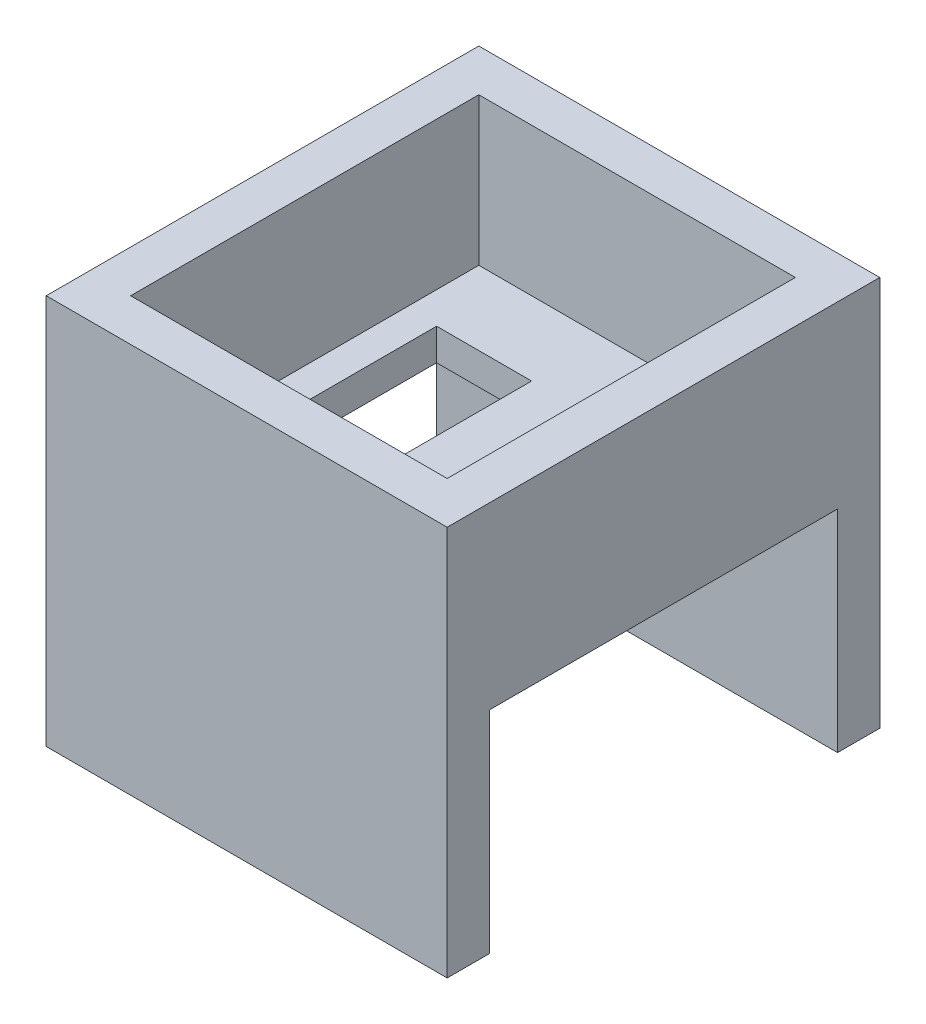
ISO-10303-21;
HEADER;
FILE_DESCRIPTION(('STEP AP214'),'2;1');
FILE_NAME('part.step','',(''),(''),'','','');
FILE_SCHEMA(('AUTOMOTIVE_DESIGN { 1 0 10303 214 1 1 1 1 }'));
ENDSEC;
DATA;
#1=APPLICATION_CONTEXT('core data for automotive mechanical design processes');
#2=APPLICATION_PROTOCOL_DEFINITION('international standard','automotive_design',2000,#1);
#3=PRODUCT_CONTEXT('',#1,'mechanical');
#4=PRODUCT('Part','Part','',(#3));
#5=PRODUCT_RELATED_PRODUCT_CATEGORY('part','',(#4));
#6=PRODUCT_DEFINITION_FORMATION('','',#4);
#7=PRODUCT_DEFINITION_CONTEXT('part definition',#1,'design');
#8=PRODUCT_DEFINITION('design','',#6,#7);
#9=PRODUCT_DEFINITION_SHAPE('','',#8);
#10=(LENGTH_UNIT() NAMED_UNIT(*) SI_UNIT(.MILLI.,.METRE.));
#11=(NAMED_UNIT(*) PLANE_ANGLE_UNIT() SI_UNIT($,.RADIAN.));
#12=(NAMED_UNIT(*) SI_UNIT($,.STERADIAN.) SOLID_ANGLE_UNIT());
#13=UNCERTAINTY_MEASURE_WITH_UNIT(LENGTH_MEASURE(1.E-05),#10,'distance_accuracy_value','');
#14=(GEOMETRIC_REPRESENTATION_CONTEXT(3) GLOBAL_UNCERTAINTY_ASSIGNED_CONTEXT((#13)) GLOBAL_UNIT_ASSIGNED_CONTEXT((#10,
#11,#12)) REPRESENTATION_CONTEXT('',''));
#15=CARTESIAN_POINT('',(0.,0.,0.));
#16=DIRECTION('',(0.,0.,1.));
#17=DIRECTION('',(1.,0.,0.));
#18=AXIS2_PLACEMENT_3D('',#15,#16,#17);
#19=CARTESIAN_POINT('',(0.,0.,0.));
#20=DIRECTION('',(0.,1.,0.));
#21=DIRECTION('',(0.,0.,1.));
#22=AXIS2_PLACEMENT_3D('',#19,#20,#21);
#23=PLANE('',#22);
#24=DIRECTION('',(0.,0.,1.));
#25=VECTOR('',#24,1.);
#26=CARTESIAN_POINT('',(-19.,0.,-20.5));
#27=LINE('',#26,#25);
#28=CARTESIAN_POINT('',(-19.,0.,16.5));
#29=VERTEX_POINT('',#28);
#30=CARTESIAN_POINT('',(-19.,0.,20.5));
#31=VERTEX_POINT('',#30);
#32=EDGE_CURVE('E251',#29,#31,#27,.T.);
#33=ORIENTED_EDGE('',*,*,#32,.F.);
#34=DIRECTION('',(-1.,0.,0.));
#35=VECTOR('',#34,1.);
#36=CARTESIAN_POINT('',(19.,0.,16.5));
#37=LINE('',#36,#35);
#38=CARTESIAN_POINT('',(19.,0.,16.5));
#39=VERTEX_POINT('',#38);
#40=EDGE_CURVE('E194',#39,#29,#37,.T.);
#41=ORIENTED_EDGE('',*,*,#40,.F.);
#42=DIRECTION('',(0.,0.,-1.));
#43=VECTOR('',#42,1.);
#44=CARTESIAN_POINT('',(19.,0.,-20.5));
#45=LINE('',#44,#43);
#46=CARTESIAN_POINT('',(19.,0.,20.5));
#47=VERTEX_POINT('',#46);
#48=EDGE_CURVE('E246',#47,#39,#45,.T.);
#49=ORIENTED_EDGE('',*,*,#48,.F.);
#50=DIRECTION('',(1.,0.,0.));
#51=VECTOR('',#50,1.);
#52=CARTESIAN_POINT('',(-19.,0.,20.5));
#53=LINE('',#52,#51);
#54=EDGE_CURVE('E239',#31,#47,#53,.T.);
#55=ORIENTED_EDGE('',*,*,#54,.F.);
#56=EDGE_LOOP('',(#33,#41,#49,#55));
#57=FACE_BOUND('',#56,.T.);
#58=ADVANCED_FACE('F35',(#57),#23,.F.);
#59=CARTESIAN_POINT('',(19.,37.,-20.5));
#60=DIRECTION('',(-1.,0.,0.));
#61=DIRECTION('',(0.,0.,1.));
#62=AXIS2_PLACEMENT_3D('',#59,#60,#61);
#63=PLANE('',#62);
#64=ORIENTED_EDGE('',*,*,#48,.T.);
#65=DIRECTION('',(0.,1.,0.));
#66=VECTOR('',#65,1.);
#67=CARTESIAN_POINT('',(19.,20.,16.5));
#68=LINE('',#67,#66);
#69=CARTESIAN_POINT('',(19.,20.,16.5));
#70=VERTEX_POINT('',#69);
#71=EDGE_CURVE('E177',#39,#70,#68,.T.);
#72=ORIENTED_EDGE('',*,*,#71,.T.);
#73=DIRECTION('',(0.,0.,-1.));
#74=VECTOR('',#73,1.);
#75=CARTESIAN_POINT('',(19.,20.,-16.5));
#76=LINE('',#75,#74);
#77=CARTESIAN_POINT('',(19.,20.,-16.5));
#78=VERTEX_POINT('',#77);
#79=EDGE_CURVE('E180',#70,#78,#76,.T.);
#80=ORIENTED_EDGE('',*,*,#79,.T.);
#81=DIRECTION('',(0.,-1.,0.));
#82=VECTOR('',#81,1.);
#83=CARTESIAN_POINT('',(19.,20.,-16.5));
#84=LINE('',#83,#82);
#85=CARTESIAN_POINT('',(19.,0.,-16.5));
#86=VERTEX_POINT('',#85);
#87=EDGE_CURVE('E184',#78,#86,#84,.T.);
#88=ORIENTED_EDGE('',*,*,#87,.T.);
#89=CARTESIAN_POINT('',(19.,0.,-20.5));
#90=VERTEX_POINT('',#89);
#91=EDGE_CURVE('E228',#86,#90,#45,.T.);
#92=ORIENTED_EDGE('',*,*,#91,.T.);
#93=DIRECTION('',(0.,-1.,0.));
#94=VECTOR('',#93,1.);
#95=CARTESIAN_POINT('',(19.,37.,-20.5));
#96=LINE('',#95,#94);
#97=CARTESIAN_POINT('',(19.,37.,-20.5));
#98=VERTEX_POINT('',#97);
#99=EDGE_CURVE('E264',#98,#90,#96,.T.);
#100=ORIENTED_EDGE('',*,*,#99,.F.);
#101=DIRECTION('',(0.,0.,-1.));
#102=VECTOR('',#101,1.);
#103=CARTESIAN_POINT('',(19.,37.,-20.5));
#104=LINE('',#103,#102);
#105=CARTESIAN_POINT('',(19.,37.,20.5));
#106=VERTEX_POINT('',#105);
#107=EDGE_CURVE('E235',#106,#98,#104,.T.);
#108=ORIENTED_EDGE('',*,*,#107,.F.);
#109=DIRECTION('',(0.,-1.,0.));
#110=VECTOR('',#109,1.);
#111=CARTESIAN_POINT('',(19.,37.,20.5));
#112=LINE('',#111,#110);
#113=EDGE_CURVE('E245',#106,#47,#112,.T.);
#114=ORIENTED_EDGE('',*,*,#113,.T.);
#115=EDGE_LOOP('',(#64,#72,#80,#88,#92,#100,#108,#114));
#116=FACE_BOUND('',#115,.T.);
#117=ADVANCED_FACE('F37',(#116),#63,.F.);
#118=CARTESIAN_POINT('',(-19.,37.,-20.5));
#119=DIRECTION('',(0.,0.,1.));
#120=DIRECTION('',(1.,0.,0.));
#121=AXIS2_PLACEMENT_3D('',#118,#119,#120);
#122=PLANE('',#121);
#123=DIRECTION('',(-1.,0.,0.));
#124=VECTOR('',#123,1.);
#125=CARTESIAN_POINT('',(-19.,0.,-20.5));
#126=LINE('',#125,#124);
#127=CARTESIAN_POINT('',(-19.,0.,-20.5));
#128=VERTEX_POINT('',#127);
#129=EDGE_CURVE('E249',#90,#128,#126,.T.);
#130=ORIENTED_EDGE('',*,*,#129,.T.);
#131=DIRECTION('',(0.,-1.,0.));
#132=VECTOR('',#131,1.);
#133=CARTESIAN_POINT('',(-19.,37.,-20.5));
#134=LINE('',#133,#132);
#135=CARTESIAN_POINT('',(-19.,37.,-20.5));
#136=VERTEX_POINT('',#135);
#137=EDGE_CURVE('E261',#136,#128,#134,.T.);
#138=ORIENTED_EDGE('',*,*,#137,.F.);
#139=DIRECTION('',(-1.,0.,0.));
#140=VECTOR('',#139,1.);
#141=CARTESIAN_POINT('',(-19.,37.,-20.5));
#142=LINE('',#141,#140);
#143=EDGE_CURVE('E238',#98,#136,#142,.T.);
#144=ORIENTED_EDGE('',*,*,#143,.F.);
#145=ORIENTED_EDGE('',*,*,#99,.T.);
#146=EDGE_LOOP('',(#130,#138,#144,#145));
#147=FACE_BOUND('',#146,.T.);
#148=ADVANCED_FACE('F295',(#147),#122,.F.);
#149=CARTESIAN_POINT('',(-19.,37.,-20.5));
#150=DIRECTION('',(1.,0.,0.));
#151=DIRECTION('',(0.,0.,-1.));
#152=AXIS2_PLACEMENT_3D('',#149,#150,#151);
#153=PLANE('',#152);
#154=DIRECTION('',(0.,0.,-1.));
#155=VECTOR('',#154,1.);
#156=CARTESIAN_POINT('',(-19.,20.,-16.5));
#157=LINE('',#156,#155);
#158=CARTESIAN_POINT('',(-19.,20.,16.5));
#159=VERTEX_POINT('',#158);
#160=CARTESIAN_POINT('',(-19.,20.,-16.5));
#161=VERTEX_POINT('',#160);
#162=EDGE_CURVE('E190',#159,#161,#157,.T.);
#163=ORIENTED_EDGE('',*,*,#162,.F.);
#164=DIRECTION('',(0.,1.,0.));
#165=VECTOR('',#164,1.);
#166=CARTESIAN_POINT('',(-19.,20.,16.5));
#167=LINE('',#166,#165);
#168=EDGE_CURVE('E174',#29,#159,#167,.T.);
#169=ORIENTED_EDGE('',*,*,#168,.F.);
#170=ORIENTED_EDGE('',*,*,#32,.T.);
#171=DIRECTION('',(0.,-1.,0.));
#172=VECTOR('',#171,1.);
#173=CARTESIAN_POINT('',(-19.,37.,20.5));
#174=LINE('',#173,#172);
#175=CARTESIAN_POINT('',(-19.,37.,20.5));
#176=VERTEX_POINT('',#175);
#177=EDGE_CURVE('E258',#176,#31,#174,.T.);
#178=ORIENTED_EDGE('',*,*,#177,.F.);
#179=DIRECTION('',(0.,0.,1.));
#180=VECTOR('',#179,1.);
#181=CARTESIAN_POINT('',(-19.,37.,-20.5));
#182=LINE('',#181,#180);
#183=EDGE_CURVE('E241',#136,#176,#182,.T.);
#184=ORIENTED_EDGE('',*,*,#183,.F.);
#185=ORIENTED_EDGE('',*,*,#137,.T.);
#186=CARTESIAN_POINT('',(-19.,0.,-16.5));
#187=VERTEX_POINT('',#186);
#188=EDGE_CURVE('E252',#128,#187,#27,.T.);
#189=ORIENTED_EDGE('',*,*,#188,.T.);
#190=DIRECTION('',(0.,-1.,0.));
#191=VECTOR('',#190,1.);
#192=CARTESIAN_POINT('',(-19.,20.,-16.5));
#193=LINE('',#192,#191);
#194=EDGE_CURVE('E181',#161,#187,#193,.T.);
#195=ORIENTED_EDGE('',*,*,#194,.F.);
#196=EDGE_LOOP('',(#163,#169,#170,#178,#184,#185,#189,#195));
#197=FACE_BOUND('',#196,.T.);
#198=ADVANCED_FACE('F324',(#197),#153,.F.);
#199=CARTESIAN_POINT('',(-19.,37.,20.5));
#200=DIRECTION('',(0.,0.,-1.));
#201=DIRECTION('',(-1.,0.,0.));
#202=AXIS2_PLACEMENT_3D('',#199,#200,#201);
#203=PLANE('',#202);
#204=ORIENTED_EDGE('',*,*,#54,.T.);
#205=ORIENTED_EDGE('',*,*,#113,.F.);
#206=DIRECTION('',(1.,0.,0.));
#207=VECTOR('',#206,1.);
#208=CARTESIAN_POINT('',(-19.,37.,20.5));
#209=LINE('',#208,#207);
#210=EDGE_CURVE('E243',#176,#106,#209,.T.);
#211=ORIENTED_EDGE('',*,*,#210,.F.);
#212=ORIENTED_EDGE('',*,*,#177,.T.);
#213=EDGE_LOOP('',(#204,#205,#211,#212));
#214=FACE_BOUND('',#213,.T.);
#215=ADVANCED_FACE('F311',(#214),#203,.F.);
#216=CARTESIAN_POINT('',(0.,37.,0.));
#217=DIRECTION('',(0.,1.,0.));
#218=DIRECTION('',(0.,0.,1.));
#219=AXIS2_PLACEMENT_3D('',#216,#217,#218);
#220=PLANE('',#219);
#221=DIRECTION('',(0.,0.,-1.));
#222=VECTOR('',#221,1.);
#223=CARTESIAN_POINT('',(15.,37.,-16.5));
#224=LINE('',#223,#222);
#225=CARTESIAN_POINT('',(15.,37.,16.5));
#226=VERTEX_POINT('',#225);
#227=CARTESIAN_POINT('',(15.,37.,-16.5));
#228=VERTEX_POINT('',#227);
#229=EDGE_CURVE('E196',#226,#228,#224,.T.);
#230=ORIENTED_EDGE('',*,*,#229,.F.);
#231=DIRECTION('',(1.,0.,0.));
#232=VECTOR('',#231,1.);
#233=CARTESIAN_POINT('',(-15.,37.,16.5));
#234=LINE('',#233,#232);
#235=CARTESIAN_POINT('',(-15.,37.,16.5));
#236=VERTEX_POINT('',#235);
#237=EDGE_CURVE('E207',#236,#226,#234,.T.);
#238=ORIENTED_EDGE('',*,*,#237,.F.);
#239=DIRECTION('',(0.,0.,1.));
#240=VECTOR('',#239,1.);
#241=CARTESIAN_POINT('',(-15.,37.,-16.5));
#242=LINE('',#241,#240);
#243=CARTESIAN_POINT('',(-15.,37.,-16.5));
#244=VERTEX_POINT('',#243);
#245=EDGE_CURVE('E221',#244,#236,#242,.T.);
#246=ORIENTED_EDGE('',*,*,#245,.F.);
#247=DIRECTION('',(-1.,0.,0.));
#248=VECTOR('',#247,1.);
#249=CARTESIAN_POINT('',(-15.,37.,-16.5));
#250=LINE('',#249,#248);
#251=EDGE_CURVE('E218',#228,#244,#250,.T.);
#252=ORIENTED_EDGE('',*,*,#251,.F.);
#253=EDGE_LOOP('',(#230,#238,#246,#252));
#254=FACE_BOUND('',#253,.T.);
#255=ORIENTED_EDGE('',*,*,#107,.T.);
#256=ORIENTED_EDGE('',*,*,#143,.T.);
#257=ORIENTED_EDGE('',*,*,#183,.T.);
#258=ORIENTED_EDGE('',*,*,#210,.T.);
#259=EDGE_LOOP('',(#255,#256,#257,#258));
#260=FACE_BOUND('',#259,.T.);
#261=ADVANCED_FACE('F302',(#254,#260),#220,.T.);
#262=ORIENTED_EDGE('',*,*,#91,.F.);
#263=DIRECTION('',(-1.,0.,0.));
#264=VECTOR('',#263,1.);
#265=CARTESIAN_POINT('',(19.,0.,-16.5));
#266=LINE('',#265,#264);
#267=EDGE_CURVE('E197',#86,#187,#266,.T.);
#268=ORIENTED_EDGE('',*,*,#267,.T.);
#269=ORIENTED_EDGE('',*,*,#188,.F.);
#270=ORIENTED_EDGE('',*,*,#129,.F.);
#271=EDGE_LOOP('',(#262,#268,#269,#270));
#272=FACE_BOUND('',#271,.T.);
#273=ADVANCED_FACE('F291',(#272),#23,.F.);
#274=CARTESIAN_POINT('',(15.,23.,-16.5));
#275=DIRECTION('',(1.,0.,0.));
#276=DIRECTION('',(0.,0.,-1.));
#277=AXIS2_PLACEMENT_3D('',#274,#275,#276);
#278=PLANE('',#277);
#279=ORIENTED_EDGE('',*,*,#229,.T.);
#280=DIRECTION('',(0.,1.,0.));
#281=VECTOR('',#280,1.);
#282=CARTESIAN_POINT('',(15.,23.,-16.5));
#283=LINE('',#282,#281);
#284=CARTESIAN_POINT('',(15.,23.,-16.5));
#285=VERTEX_POINT('',#284);
#286=EDGE_CURVE('E216',#285,#228,#283,.T.);
#287=ORIENTED_EDGE('',*,*,#286,.F.);
#288=DIRECTION('',(0.,0.,-1.));
#289=VECTOR('',#288,1.);
#290=CARTESIAN_POINT('',(15.,23.,-16.5));
#291=LINE('',#290,#289);
#292=CARTESIAN_POINT('',(15.,23.,16.5));
#293=VERTEX_POINT('',#292);
#294=EDGE_CURVE('E203',#293,#285,#291,.T.);
#295=ORIENTED_EDGE('',*,*,#294,.F.);
#296=DIRECTION('',(0.,1.,0.));
#297=VECTOR('',#296,1.);
#298=CARTESIAN_POINT('',(15.,23.,16.5));
#299=LINE('',#298,#297);
#300=EDGE_CURVE('E226',#293,#226,#299,.T.);
#301=ORIENTED_EDGE('',*,*,#300,.T.);
#302=EDGE_LOOP('',(#279,#287,#295,#301));
#303=FACE_BOUND('',#302,.T.);
#304=ADVANCED_FACE('F301',(#303),#278,.F.);
#305=CARTESIAN_POINT('',(-15.,23.,16.5));
#306=DIRECTION('',(0.,0.,1.));
#307=DIRECTION('',(1.,0.,0.));
#308=AXIS2_PLACEMENT_3D('',#305,#306,#307);
#309=PLANE('',#308);
#310=ORIENTED_EDGE('',*,*,#237,.T.);
#311=ORIENTED_EDGE('',*,*,#300,.F.);
#312=DIRECTION('',(1.,0.,0.));
#313=VECTOR('',#312,1.);
#314=CARTESIAN_POINT('',(-15.,23.,16.5));
#315=LINE('',#314,#313);
#316=CARTESIAN_POINT('',(-15.,23.,16.5));
#317=VERTEX_POINT('',#316);
#318=EDGE_CURVE('E213',#317,#293,#315,.T.);
#319=ORIENTED_EDGE('',*,*,#318,.F.);
#320=DIRECTION('',(0.,1.,0.));
#321=VECTOR('',#320,1.);
#322=CARTESIAN_POINT('',(-15.,23.,16.5));
#323=LINE('',#322,#321);
#324=EDGE_CURVE('E229',#317,#236,#323,.T.);
#325=ORIENTED_EDGE('',*,*,#324,.T.);
#326=EDGE_LOOP('',(#310,#311,#319,#325));
#327=FACE_BOUND('',#326,.T.);
#328=ADVANCED_FACE('F308',(#327),#309,.F.);
#329=CARTESIAN_POINT('',(-15.,23.,-16.5));
#330=DIRECTION('',(-1.,0.,0.));
#331=DIRECTION('',(0.,0.,1.));
#332=AXIS2_PLACEMENT_3D('',#329,#330,#331);
#333=PLANE('',#332);
#334=ORIENTED_EDGE('',*,*,#245,.T.);
#335=ORIENTED_EDGE('',*,*,#324,.F.);
#336=DIRECTION('',(0.,0.,1.));
#337=VECTOR('',#336,1.);
#338=CARTESIAN_POINT('',(-15.,23.,-16.5));
#339=LINE('',#338,#337);
#340=CARTESIAN_POINT('',(-15.,23.,-16.5));
#341=VERTEX_POINT('',#340);
#342=EDGE_CURVE('E210',#341,#317,#339,.T.);
#343=ORIENTED_EDGE('',*,*,#342,.F.);
#344=DIRECTION('',(0.,1.,0.));
#345=VECTOR('',#344,1.);
#346=CARTESIAN_POINT('',(-15.,23.,-16.5));
#347=LINE('',#346,#345);
#348=EDGE_CURVE('E231',#341,#244,#347,.T.);
#349=ORIENTED_EDGE('',*,*,#348,.T.);
#350=EDGE_LOOP('',(#334,#335,#343,#349));
#351=FACE_BOUND('',#350,.T.);
#352=ADVANCED_FACE('F427',(#351),#333,.F.);
#353=CARTESIAN_POINT('',(-15.,23.,-16.5));
#354=DIRECTION('',(0.,0.,-1.));
#355=DIRECTION('',(-1.,0.,0.));
#356=AXIS2_PLACEMENT_3D('',#353,#354,#355);
#357=PLANE('',#356);
#358=ORIENTED_EDGE('',*,*,#251,.T.);
#359=ORIENTED_EDGE('',*,*,#348,.F.);
#360=DIRECTION('',(-1.,0.,0.));
#361=VECTOR('',#360,1.);
#362=CARTESIAN_POINT('',(-15.,23.,-16.5));
#363=LINE('',#362,#361);
#364=EDGE_CURVE('E206',#285,#341,#363,.T.);
#365=ORIENTED_EDGE('',*,*,#364,.F.);
#366=ORIENTED_EDGE('',*,*,#286,.T.);
#367=EDGE_LOOP('',(#358,#359,#365,#366));
#368=FACE_BOUND('',#367,.T.);
#369=ADVANCED_FACE('F388',(#368),#357,.F.);
#370=CARTESIAN_POINT('',(0.,23.,0.));
#371=DIRECTION('',(0.,1.,0.));
#372=DIRECTION('',(0.,0.,1.));
#373=AXIS2_PLACEMENT_3D('',#370,#371,#372);
#374=PLANE('',#373);
#375=DIRECTION('',(0.,0.,-1.));
#376=VECTOR('',#375,1.);
#377=CARTESIAN_POINT('',(-3.,23.,-9.5));
#378=LINE('',#377,#376);
#379=CARTESIAN_POINT('',(-3.,23.,9.5));
#380=VERTEX_POINT('',#379);
#381=CARTESIAN_POINT('',(-3.,23.,-9.5));
#382=VERTEX_POINT('',#381);
#383=EDGE_CURVE('E50',#380,#382,#378,.T.);
#384=ORIENTED_EDGE('',*,*,#383,.F.);
#385=DIRECTION('',(1.,0.,0.));
#386=VECTOR('',#385,1.);
#387=CARTESIAN_POINT('',(-12.,23.,9.5));
#388=LINE('',#387,#386);
#389=CARTESIAN_POINT('',(-12.,23.,9.5));
#390=VERTEX_POINT('',#389);
#391=EDGE_CURVE('E167',#390,#380,#388,.T.);
#392=ORIENTED_EDGE('',*,*,#391,.F.);
#393=DIRECTION('',(0.,0.,1.));
#394=VECTOR('',#393,1.);
#395=CARTESIAN_POINT('',(-12.,23.,-9.5));
#396=LINE('',#395,#394);
#397=CARTESIAN_POINT('',(-12.,23.,-9.5));
#398=VERTEX_POINT('',#397);
#399=EDGE_CURVE('E151',#398,#390,#396,.T.);
#400=ORIENTED_EDGE('',*,*,#399,.F.);
#401=DIRECTION('',(-1.,0.,0.));
#402=VECTOR('',#401,1.);
#403=CARTESIAN_POINT('',(-12.,23.,-9.5));
#404=LINE('',#403,#402);
#405=EDGE_CURVE('E160',#382,#398,#404,.T.);
#406=ORIENTED_EDGE('',*,*,#405,.F.);
#407=EDGE_LOOP('',(#384,#392,#400,#406));
#408=FACE_BOUND('',#407,.T.);
#409=ORIENTED_EDGE('',*,*,#294,.T.);
#410=ORIENTED_EDGE('',*,*,#364,.T.);
#411=ORIENTED_EDGE('',*,*,#342,.T.);
#412=ORIENTED_EDGE('',*,*,#318,.T.);
#413=EDGE_LOOP('',(#409,#410,#411,#412));
#414=FACE_BOUND('',#413,.T.);
#415=ADVANCED_FACE('F164',(#408,#414),#374,.T.);
#416=CARTESIAN_POINT('',(19.,20.,16.5));
#417=DIRECTION('',(0.,0.,1.));
#418=DIRECTION('',(0.,-1.,0.));
#419=AXIS2_PLACEMENT_3D('',#416,#417,#418);
#420=PLANE('',#419);
#421=ORIENTED_EDGE('',*,*,#168,.T.);
#422=DIRECTION('',(-1.,0.,0.));
#423=VECTOR('',#422,1.);
#424=CARTESIAN_POINT('',(19.,20.,16.5));
#425=LINE('',#424,#423);
#426=EDGE_CURVE('E187',#70,#159,#425,.T.);
#427=ORIENTED_EDGE('',*,*,#426,.F.);
#428=ORIENTED_EDGE('',*,*,#71,.F.);
#429=ORIENTED_EDGE('',*,*,#40,.T.);
#430=EDGE_LOOP('',(#421,#427,#428,#429));
#431=FACE_BOUND('',#430,.T.);
#432=ADVANCED_FACE('F338',(#431),#420,.F.);
#433=CARTESIAN_POINT('',(19.,20.,-16.5));
#434=DIRECTION('',(0.,0.,-1.));
#435=DIRECTION('',(0.,1.,0.));
#436=AXIS2_PLACEMENT_3D('',#433,#434,#435);
#437=PLANE('',#436);
#438=ORIENTED_EDGE('',*,*,#194,.T.);
#439=ORIENTED_EDGE('',*,*,#267,.F.);
#440=ORIENTED_EDGE('',*,*,#87,.F.);
#441=DIRECTION('',(-1.,0.,0.));
#442=VECTOR('',#441,1.);
#443=CARTESIAN_POINT('',(19.,20.,-16.5));
#444=LINE('',#443,#442);
#445=EDGE_CURVE('E200',#78,#161,#444,.T.);
#446=ORIENTED_EDGE('',*,*,#445,.T.);
#447=EDGE_LOOP('',(#438,#439,#440,#446));
#448=FACE_BOUND('',#447,.T.);
#449=ADVANCED_FACE('F284',(#448),#437,.F.);
#450=CARTESIAN_POINT('',(19.,20.,-16.5));
#451=DIRECTION('',(0.,1.,0.));
#452=DIRECTION('',(0.,0.,1.));
#453=AXIS2_PLACEMENT_3D('',#450,#451,#452);
#454=PLANE('',#453);
#455=DIRECTION('',(1.,0.,0.));
#456=VECTOR('',#455,1.);
#457=CARTESIAN_POINT('',(19.,20.,9.5));
#458=LINE('',#457,#456);
#459=CARTESIAN_POINT('',(-12.,20.,9.5));
#460=VERTEX_POINT('',#459);
#461=CARTESIAN_POINT('',(-3.,20.,9.5));
#462=VERTEX_POINT('',#461);
#463=EDGE_CURVE('E43',#460,#462,#458,.T.);
#464=ORIENTED_EDGE('',*,*,#463,.T.);
#465=DIRECTION('',(0.,0.,-1.));
#466=VECTOR('',#465,1.);
#467=CARTESIAN_POINT('',(-3.,20.,-16.5));
#468=LINE('',#467,#466);
#469=CARTESIAN_POINT('',(-3.,20.,-9.5));
#470=VERTEX_POINT('',#469);
#471=EDGE_CURVE('E11',#462,#470,#468,.T.);
#472=ORIENTED_EDGE('',*,*,#471,.T.);
#473=DIRECTION('',(-1.,0.,0.));
#474=VECTOR('',#473,1.);
#475=CARTESIAN_POINT('',(19.,20.,-9.5));
#476=LINE('',#475,#474);
#477=CARTESIAN_POINT('',(-12.,20.,-9.5));
#478=VERTEX_POINT('',#477);
#479=EDGE_CURVE('E267',#470,#478,#476,.T.);
#480=ORIENTED_EDGE('',*,*,#479,.T.);
#481=DIRECTION('',(0.,0.,1.));
#482=VECTOR('',#481,1.);
#483=CARTESIAN_POINT('',(-12.,20.,-16.5));
#484=LINE('',#483,#482);
#485=EDGE_CURVE('E154',#478,#460,#484,.T.);
#486=ORIENTED_EDGE('',*,*,#485,.T.);
#487=EDGE_LOOP('',(#464,#472,#480,#486));
#488=FACE_BOUND('',#487,.T.);
#489=ORIENTED_EDGE('',*,*,#162,.T.);
#490=ORIENTED_EDGE('',*,*,#445,.F.);
#491=ORIENTED_EDGE('',*,*,#79,.F.);
#492=ORIENTED_EDGE('',*,*,#426,.T.);
#493=EDGE_LOOP('',(#489,#490,#491,#492));
#494=FACE_BOUND('',#493,.T.);
#495=ADVANCED_FACE('F271',(#488,#494),#454,.F.);
#496=CARTESIAN_POINT('',(-3.,0.,-9.5));
#497=DIRECTION('',(1.,0.,0.));
#498=DIRECTION('',(0.,0.,-1.));
#499=AXIS2_PLACEMENT_3D('',#496,#497,#498);
#500=PLANE('',#499);
#501=DIRECTION('',(0.,1.,0.));
#502=VECTOR('',#501,1.);
#503=CARTESIAN_POINT('',(-3.,0.,9.5));
#504=LINE('',#503,#502);
#505=EDGE_CURVE('E172',#462,#380,#504,.T.);
#506=ORIENTED_EDGE('',*,*,#505,.T.);
#507=ORIENTED_EDGE('',*,*,#383,.T.);
#508=DIRECTION('',(0.,1.,0.));
#509=VECTOR('',#508,1.);
#510=CARTESIAN_POINT('',(-3.,0.,-9.5));
#511=LINE('',#510,#509);
#512=EDGE_CURVE('E157',#470,#382,#511,.T.);
#513=ORIENTED_EDGE('',*,*,#512,.F.);
#514=ORIENTED_EDGE('',*,*,#471,.F.);
#515=EDGE_LOOP('',(#506,#507,#513,#514));
#516=FACE_BOUND('',#515,.T.);
#517=ADVANCED_FACE('F276',(#516),#500,.F.);
#518=CARTESIAN_POINT('',(-12.,0.,9.5));
#519=DIRECTION('',(0.,0.,1.));
#520=DIRECTION('',(1.,0.,0.));
#521=AXIS2_PLACEMENT_3D('',#518,#519,#520);
#522=PLANE('',#521);
#523=DIRECTION('',(0.,1.,0.));
#524=VECTOR('',#523,1.);
#525=CARTESIAN_POINT('',(-12.,0.,9.5));
#526=LINE('',#525,#524);
#527=EDGE_CURVE('E156',#460,#390,#526,.T.);
#528=ORIENTED_EDGE('',*,*,#527,.T.);
#529=ORIENTED_EDGE('',*,*,#391,.T.);
#530=ORIENTED_EDGE('',*,*,#505,.F.);
#531=ORIENTED_EDGE('',*,*,#463,.F.);
#532=EDGE_LOOP('',(#528,#529,#530,#531));
#533=FACE_BOUND('',#532,.T.);
#534=ADVANCED_FACE('F275',(#533),#522,.F.);
#535=CARTESIAN_POINT('',(-12.,0.,-9.5));
#536=DIRECTION('',(-1.,0.,0.));
#537=DIRECTION('',(0.,0.,1.));
#538=AXIS2_PLACEMENT_3D('',#535,#536,#537);
#539=PLANE('',#538);
#540=DIRECTION('',(0.,1.,0.));
#541=VECTOR('',#540,1.);
#542=CARTESIAN_POINT('',(-12.,0.,-9.5));
#543=LINE('',#542,#541);
#544=EDGE_CURVE('E58',#478,#398,#543,.T.);
#545=ORIENTED_EDGE('',*,*,#544,.T.);
#546=ORIENTED_EDGE('',*,*,#399,.T.);
#547=ORIENTED_EDGE('',*,*,#527,.F.);
#548=ORIENTED_EDGE('',*,*,#485,.F.);
#549=EDGE_LOOP('',(#545,#546,#547,#548));
#550=FACE_BOUND('',#549,.T.);
#551=ADVANCED_FACE('F148',(#550),#539,.F.);
#552=CARTESIAN_POINT('',(-12.,0.,-9.5));
#553=DIRECTION('',(0.,0.,-1.));
#554=DIRECTION('',(-1.,0.,0.));
#555=AXIS2_PLACEMENT_3D('',#552,#553,#554);
#556=PLANE('',#555);
#557=ORIENTED_EDGE('',*,*,#512,.T.);
#558=ORIENTED_EDGE('',*,*,#405,.T.);
#559=ORIENTED_EDGE('',*,*,#544,.F.);
#560=ORIENTED_EDGE('',*,*,#479,.F.);
#561=EDGE_LOOP('',(#557,#558,#559,#560));
#562=FACE_BOUND('',#561,.T.);
#563=ADVANCED_FACE('F161',(#562),#556,.F.);
#564=CLOSED_SHELL('',(#58,#117,#148,#198,#215,#261,#273,#304,#328,#352,#369,#415,#432,#449,#495,
#517,#534,#551,#563));
#565=MANIFOLD_SOLID_BREP('B2',#564);
#566=ADVANCED_BREP_SHAPE_REPRESENTATION('',(#18,#565),#14);
#567=SHAPE_DEFINITION_REPRESENTATION(#9,#566);
ENDSEC;
END-ISO-10303-21;
